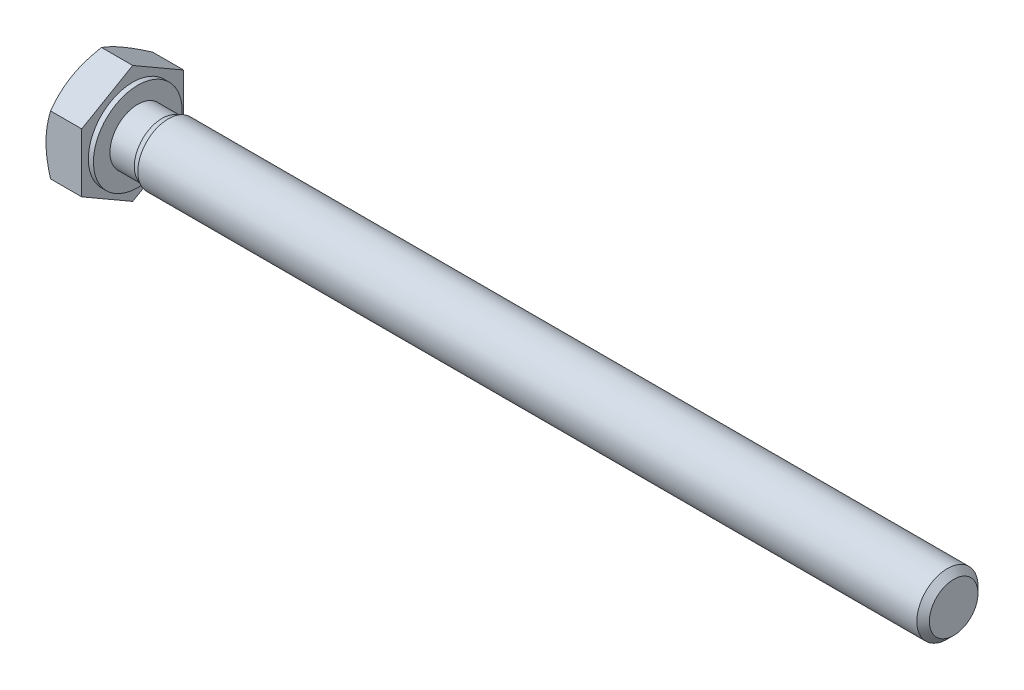
ISO-10303-21;
HEADER;
FILE_DESCRIPTION(('STEP AP214'),'2;1');
FILE_NAME('part.step','',(''),(''),'','','');
FILE_SCHEMA(('AUTOMOTIVE_DESIGN { 1 0 10303 214 1 1 1 1 }'));
ENDSEC;
DATA;
#1=APPLICATION_CONTEXT('core data for automotive mechanical design processes');
#2=APPLICATION_PROTOCOL_DEFINITION('international standard','automotive_design',2000,#1);
#3=PRODUCT_CONTEXT('',#1,'mechanical');
#4=PRODUCT('Part','Part','',(#3));
#5=PRODUCT_RELATED_PRODUCT_CATEGORY('part','',(#4));
#6=PRODUCT_DEFINITION_FORMATION('','',#4);
#7=PRODUCT_DEFINITION_CONTEXT('part definition',#1,'design');
#8=PRODUCT_DEFINITION('design','',#6,#7);
#9=PRODUCT_DEFINITION_SHAPE('','',#8);
#10=(LENGTH_UNIT() NAMED_UNIT(*) SI_UNIT(.MILLI.,.METRE.));
#11=(NAMED_UNIT(*) PLANE_ANGLE_UNIT() SI_UNIT($,.RADIAN.));
#12=(NAMED_UNIT(*) SI_UNIT($,.STERADIAN.) SOLID_ANGLE_UNIT());
#13=UNCERTAINTY_MEASURE_WITH_UNIT(LENGTH_MEASURE(1.E-05),#10,'distance_accuracy_value','');
#14=(GEOMETRIC_REPRESENTATION_CONTEXT(3) GLOBAL_UNCERTAINTY_ASSIGNED_CONTEXT((#13)) GLOBAL_UNIT_ASSIGNED_CONTEXT((#10,
#11,#12)) REPRESENTATION_CONTEXT('',''));
#15=CARTESIAN_POINT('',(0.,0.,0.));
#16=DIRECTION('',(0.,0.,1.));
#17=DIRECTION('',(1.,0.,0.));
#18=AXIS2_PLACEMENT_3D('',#15,#16,#17);
#19=CARTESIAN_POINT('',(-4.00009999999999,0.,0.));
#20=DIRECTION('',(1.,0.,0.));
#21=DIRECTION('',(0.,1.,0.));
#22=AXIS2_PLACEMENT_3D('',#19,#20,#21);
#23=PLANE('',#22);
#24=CARTESIAN_POINT('',(-4.00009999998474,0.,0.));
#25=DIRECTION('',(1.,0.,0.));
#26=DIRECTION('',(0.,0.,-1.));
#27=AXIS2_PLACEMENT_3D('',#24,#25,#26);
#28=CIRCLE('',#27,5.0000000000523);
#29=CARTESIAN_POINT('',(-4.00009999999984,4.33012701894484,-2.50000000001307));
#30=VERTEX_POINT('',#29);
#31=CARTESIAN_POINT('',(-4.00009999999984,4.33012701894484,2.50000000001307));
#32=VERTEX_POINT('',#31);
#33=EDGE_CURVE('E372',#30,#32,#28,.T.);
#34=ORIENTED_EDGE('',*,*,#33,.F.);
#35=CARTESIAN_POINT('',(-4.00009999998474,0.,0.));
#36=DIRECTION('',(1.,0.,0.));
#37=DIRECTION('',(0.,0.,-1.));
#38=AXIS2_PLACEMENT_3D('',#35,#36,#37);
#39=CIRCLE('',#38,5.0000000000523);
#40=CARTESIAN_POINT('',(-4.00009999999984,0.,-5.00000000002615));
#41=VERTEX_POINT('',#40);
#42=EDGE_CURVE('E368',#41,#30,#39,.T.);
#43=ORIENTED_EDGE('',*,*,#42,.F.);
#44=CARTESIAN_POINT('',(-4.00009999998474,0.,0.));
#45=DIRECTION('',(1.,0.,0.));
#46=DIRECTION('',(0.,0.,-1.));
#47=AXIS2_PLACEMENT_3D('',#44,#45,#46);
#48=CIRCLE('',#47,5.0000000000523);
#49=CARTESIAN_POINT('',(-4.00009999999984,-4.33012701894484,-2.50000000001307));
#50=VERTEX_POINT('',#49);
#51=EDGE_CURVE('E364',#50,#41,#48,.T.);
#52=ORIENTED_EDGE('',*,*,#51,.F.);
#53=CARTESIAN_POINT('',(-4.00009999998474,0.,0.));
#54=DIRECTION('',(1.,0.,0.));
#55=DIRECTION('',(0.,0.,-1.));
#56=AXIS2_PLACEMENT_3D('',#53,#54,#55);
#57=CIRCLE('',#56,5.0000000000523);
#58=CARTESIAN_POINT('',(-4.00009999999984,-4.33012701894483,2.50000000001308));
#59=VERTEX_POINT('',#58);
#60=EDGE_CURVE('E91',#59,#50,#57,.T.);
#61=ORIENTED_EDGE('',*,*,#60,.F.);
#62=CARTESIAN_POINT('',(-4.00009999998474,0.,0.));
#63=DIRECTION('',(1.,0.,0.));
#64=DIRECTION('',(0.,0.,-1.));
#65=AXIS2_PLACEMENT_3D('',#62,#63,#64);
#66=CIRCLE('',#65,5.0000000000523);
#67=CARTESIAN_POINT('',(-4.00009999999984,0.,5.00000000002615));
#68=VERTEX_POINT('',#67);
#69=EDGE_CURVE('E88',#68,#59,#66,.T.);
#70=ORIENTED_EDGE('',*,*,#69,.F.);
#71=CARTESIAN_POINT('',(-4.00009999998474,0.,0.));
#72=DIRECTION('',(1.,0.,0.));
#73=DIRECTION('',(0.,0.,-1.));
#74=AXIS2_PLACEMENT_3D('',#71,#72,#73);
#75=CIRCLE('',#74,5.0000000000523);
#76=EDGE_CURVE('E20',#32,#68,#75,.T.);
#77=ORIENTED_EDGE('',*,*,#76,.F.);
#78=EDGE_LOOP('',(#34,#43,#52,#61,#70,#77));
#79=FACE_BOUND('',#78,.T.);
#80=ADVANCED_FACE('F17',(#79),#23,.F.);
#81=CARTESIAN_POINT('',(-3.55083852070948,0.,0.));
#82=DIRECTION('',(1.,0.,0.));
#83=DIRECTION('',(0.,0.,-1.));
#84=AXIS2_PLACEMENT_3D('',#81,#82,#83);
#85=CONICAL_SURFACE('',#84,5.77814370802798,1.04719755118957);
#86=ORIENTED_EDGE('',*,*,#76,.T.);
#87=CARTESIAN_POINT('',(-3.5535180126219,2.88675134595014,5.));
#88=CARTESIAN_POINT('',(-3.6213680084028,2.65177101636253,5.));
#89=CARTESIAN_POINT('',(-3.68353045031979,2.41490887985414,5.));
#90=CARTESIAN_POINT('',(-3.7931527974163,1.93909669052147,5.));
#91=CARTESIAN_POINT('',(-3.84068540344243,1.70016323445544,5.));
#92=CARTESIAN_POINT('',(-3.8990473736487,1.33950809840886,5.));
#93=CARTESIAN_POINT('',(-3.91635229197859,1.21883413511203,5.));
#94=CARTESIAN_POINT('',(-3.94630746633662,0.976908493067109,5.));
#95=CARTESIAN_POINT('',(-3.95895784487578,0.855656829609632,5.));
#96=CARTESIAN_POINT('',(-3.97938167271728,0.612127292346121,5.));
#97=CARTESIAN_POINT('',(-3.987130320757,0.489847322565377,5.));
#98=CARTESIAN_POINT('',(-3.99750020954607,0.245046897906998,5.));
#99=CARTESIAN_POINT('',(-4.00012043482862,0.12252640020956,5.));
#100=CARTESIAN_POINT('',(-4.00010000001493,0.,5.));
#101=B_SPLINE_CURVE_WITH_KNOTS('',3,(#87,#88,#89,#90,#91,#92,#93,#94,#95,#96,#97,#98,#99,#100),
.UNSPECIFIED.,.F.,.F.,(4,2,2,2,2,2,4),(0.,0.734036658391596,1.46436443241683,1.83000749078349,
2.19564092445833,2.563109858667,2.93065154716785),.UNSPECIFIED.);
#102=CARTESIAN_POINT('',(-3.5535180126219,2.88675134594861,5.00000000000089));
#103=VERTEX_POINT('',#102);
#104=EDGE_CURVE('E109',#103,#68,#101,.T.);
#105=ORIENTED_EDGE('',*,*,#104,.F.);
#106=CARTESIAN_POINT('',(-4.00010000001494,4.33012701892219,2.5));
#107=CARTESIAN_POINT('',(-4.00012043482862,4.2688638188174,2.60611097521574));
#108=CARTESIAN_POINT('',(-3.99750020954607,4.20760356996868,2.71221683870603));
#109=CARTESIAN_POINT('',(-3.987130320757,4.08520335763949,2.92422022531741));
#110=CARTESIAN_POINT('',(-3.97938167271728,4.02406337274912,3.03011778552153));
#111=CARTESIAN_POINT('',(-3.95895784487578,3.90229860411736,3.2410205513636));
#112=CARTESIAN_POINT('',(-3.94630746633662,3.84167277238862,3.3460275721689));
#113=CARTESIAN_POINT('',(-3.91635229197859,3.72070995136616,3.55554132400667));
#114=CARTESIAN_POINT('',(-3.8990473736487,3.66037296971774,3.66004804179708));
#115=CARTESIAN_POINT('',(-3.84068540344243,3.48004540169445,3.97238455161875));
#116=CARTESIAN_POINT('',(-3.7931527974163,3.36057867366143,4.17930699438595));
#117=CARTESIAN_POINT('',(-3.68353045031978,3.12267257899509,4.59137243777834));
#118=CARTESIAN_POINT('',(-3.62136800840279,3.0042415107409,4.79650106518927));
#119=CARTESIAN_POINT('',(-3.55351801262189,2.88675134594709,5.00000000000178));
#120=B_SPLINE_CURVE_WITH_KNOTS('',3,(#106,#107,#108,#109,#110,#111,#112,#113,#114,#115,#116,
#117,#118,#119),.UNSPECIFIED.,.F.,.F.,(4,2,2,2,2,2,4),(0.,0.36754168850086,0.735010622709534,
1.10064405638438,1.46628711475104,2.19661488877629,2.9306515471679),.UNSPECIFIED.);
#121=EDGE_CURVE('E103',#32,#103,#120,.T.);
#122=ORIENTED_EDGE('',*,*,#121,.F.);
#123=EDGE_LOOP('',(#86,#105,#122));
#124=FACE_BOUND('',#123,.T.);
#125=ADVANCED_FACE('F108',(#124),#85,.T.);
#126=CARTESIAN_POINT('',(-3.55083852070948,0.,0.));
#127=DIRECTION('',(1.,0.,0.));
#128=DIRECTION('',(0.,0.,-1.));
#129=AXIS2_PLACEMENT_3D('',#126,#127,#128);
#130=CONICAL_SURFACE('',#129,5.77814370802798,1.04719755118957);
#131=CARTESIAN_POINT('',(-4.00010000001493,0.,5.));
#132=CARTESIAN_POINT('',(-4.00012043482862,-0.122526400209565,5.));
#133=CARTESIAN_POINT('',(-3.99750020954607,-0.245046897907004,5.));
#134=CARTESIAN_POINT('',(-3.987130320757,-0.489847322565383,5.));
#135=CARTESIAN_POINT('',(-3.97938167271728,-0.612127292346127,5.));
#136=CARTESIAN_POINT('',(-3.95895784487578,-0.85565682960964,5.));
#137=CARTESIAN_POINT('',(-3.94630746633662,-0.976908493067117,5.));
#138=CARTESIAN_POINT('',(-3.91635229197859,-1.21883413511204,5.));
#139=CARTESIAN_POINT('',(-3.8990473736487,-1.33950809840887,5.));
#140=CARTESIAN_POINT('',(-3.84068540344243,-1.70016323445545,5.));
#141=CARTESIAN_POINT('',(-3.7931527974163,-1.93909669052148,5.));
#142=CARTESIAN_POINT('',(-3.68353045031978,-2.41490887985415,5.));
#143=CARTESIAN_POINT('',(-3.6213680084028,-2.65177101636254,5.));
#144=CARTESIAN_POINT('',(-3.5535180126219,-2.88675134595016,5.));
#145=B_SPLINE_CURVE_WITH_KNOTS('',3,(#131,#132,#133,#134,#135,#136,#137,#138,#139,#140,#141,
#142,#143,#144),.UNSPECIFIED.,.F.,.F.,(4,2,2,2,2,2,4),(0.,0.367541688500856,0.735010622709525,
1.10064405638437,1.46628711475103,2.19661488877626,2.93065154716786),.UNSPECIFIED.);
#146=CARTESIAN_POINT('',(-3.5535180126219,-2.88675134594863,5.00000000000089));
#147=VERTEX_POINT('',#146);
#148=EDGE_CURVE('E96',#68,#147,#145,.T.);
#149=ORIENTED_EDGE('',*,*,#148,.F.);
#150=ORIENTED_EDGE('',*,*,#69,.T.);
#151=CARTESIAN_POINT('',(-3.55351801262189,-2.8867513459471,5.00000000000177));
#152=CARTESIAN_POINT('',(-3.62136800840279,-3.00424151074091,4.79650106518926));
#153=CARTESIAN_POINT('',(-3.68353045031978,-3.12267257899511,4.59137243777833));
#154=CARTESIAN_POINT('',(-3.7931527974163,-3.36057867366144,4.17930699438595));
#155=CARTESIAN_POINT('',(-3.84068540344242,-3.48004540169446,3.97238455161875));
#156=CARTESIAN_POINT('',(-3.8990473736487,-3.66037296971775,3.66004804179708));
#157=CARTESIAN_POINT('',(-3.91635229197859,-3.72070995136617,3.55554132400667));
#158=CARTESIAN_POINT('',(-3.94630746633662,-3.84167277238863,3.3460275721689));
#159=CARTESIAN_POINT('',(-3.95895784487578,-3.90229860411737,3.2410205513636));
#160=CARTESIAN_POINT('',(-3.97938167271728,-4.02406337274912,3.03011778552153));
#161=CARTESIAN_POINT('',(-3.987130320757,-4.0852033576395,2.92422022531741));
#162=CARTESIAN_POINT('',(-3.99750020954607,-4.20760356996869,2.71221683870604));
#163=CARTESIAN_POINT('',(-4.00012043482862,-4.26886381881741,2.60611097521574));
#164=CARTESIAN_POINT('',(-4.00010000001494,-4.33012701892219,2.5));
#165=B_SPLINE_CURVE_WITH_KNOTS('',3,(#151,#152,#153,#154,#155,#156,#157,#158,#159,#160,#161,
#162,#163,#164),.UNSPECIFIED.,.F.,.F.,(4,2,2,2,2,2,4),(0.,0.734036658391605,1.46436443241685,
1.83000749078351,2.19564092445836,2.56310985866703,2.93065154716789),.UNSPECIFIED.);
#166=EDGE_CURVE('E98',#147,#59,#165,.T.);
#167=ORIENTED_EDGE('',*,*,#166,.F.);
#168=EDGE_LOOP('',(#149,#150,#167));
#169=FACE_BOUND('',#168,.T.);
#170=ADVANCED_FACE('F97',(#169),#130,.T.);
#171=CARTESIAN_POINT('',(-3.55083852070948,0.,0.));
#172=DIRECTION('',(1.,0.,0.));
#173=DIRECTION('',(0.,0.,-1.));
#174=AXIS2_PLACEMENT_3D('',#171,#172,#173);
#175=CONICAL_SURFACE('',#174,5.77814370802798,1.04719755118957);
#176=CARTESIAN_POINT('',(-4.00010000001494,-4.33012701892219,2.5));
#177=CARTESIAN_POINT('',(-4.00012043482862,-4.39139021902697,2.39388902478426));
#178=CARTESIAN_POINT('',(-3.99750020954607,-4.45265046787569,2.28778316129396));
#179=CARTESIAN_POINT('',(-3.987130320757,-4.57505068020488,2.07577977468259));
#180=CARTESIAN_POINT('',(-3.97938167271728,-4.63619066509525,1.96988221447847));
#181=CARTESIAN_POINT('',(-3.95895784487578,-4.75795543372701,1.7589794486364));
#182=CARTESIAN_POINT('',(-3.94630746633662,-4.81858126545575,1.6539724278311));
#183=CARTESIAN_POINT('',(-3.91635229197859,-4.93954408647821,1.44445867599334));
#184=CARTESIAN_POINT('',(-3.8990473736487,-4.99988106812662,1.33995195820293));
#185=CARTESIAN_POINT('',(-3.84068540344243,-5.18020863614991,1.02761544838126));
#186=CARTESIAN_POINT('',(-3.7931527974163,-5.29967536418293,0.820693005614064));
#187=CARTESIAN_POINT('',(-3.68353045031979,-5.53758145884926,0.408627562221682));
#188=CARTESIAN_POINT('',(-3.6213680084028,-5.65601252710346,0.203498934810755));
#189=CARTESIAN_POINT('',(-3.5535180126219,-5.77350269189727,-1.75765285842056E-12));
#190=B_SPLINE_CURVE_WITH_KNOTS('',3,(#176,#177,#178,#179,#180,#181,#182,#183,#184,#185,#186,
#187,#188,#189),.UNSPECIFIED.,.F.,.F.,(4,2,2,2,2,2,4),(0.,0.367541688500856,0.735010622709525,
1.10064405638437,1.46628711475103,2.19661488877627,2.93065154716787),.UNSPECIFIED.);
#191=CARTESIAN_POINT('',(-3.5535180126219,-5.77350269189727,0.));
#192=VERTEX_POINT('',#191);
#193=EDGE_CURVE('E114',#59,#192,#190,.T.);
#194=ORIENTED_EDGE('',*,*,#193,.F.);
#195=ORIENTED_EDGE('',*,*,#60,.T.);
#196=CARTESIAN_POINT('',(-3.55351801262189,-5.77350269189728,1.78056399076284E-12));
#197=CARTESIAN_POINT('',(-3.62136800840279,-5.65601252710347,-0.203498934810734));
#198=CARTESIAN_POINT('',(-3.68353045031978,-5.53758145884927,-0.408627562221662));
#199=CARTESIAN_POINT('',(-3.7931527974163,-5.29967536418294,-0.820693005614048));
#200=CARTESIAN_POINT('',(-3.84068540344243,-5.18020863614992,-1.02761544838124));
#201=CARTESIAN_POINT('',(-3.8990473736487,-4.99988106812663,-1.33995195820292));
#202=CARTESIAN_POINT('',(-3.91635229197859,-4.93954408647821,-1.44445867599333));
#203=CARTESIAN_POINT('',(-3.94630746633662,-4.81858126545575,-1.65397242783109));
#204=CARTESIAN_POINT('',(-3.95895784487578,-4.75795543372701,-1.75897944863639));
#205=CARTESIAN_POINT('',(-3.97938167271728,-4.63619066509525,-1.96988221447846));
#206=CARTESIAN_POINT('',(-3.987130320757,-4.57505068020488,-2.07577977468258));
#207=CARTESIAN_POINT('',(-3.99750020954607,-4.45265046787569,-2.28778316129396));
#208=CARTESIAN_POINT('',(-4.00012043482862,-4.39139021902697,-2.39388902478426));
#209=CARTESIAN_POINT('',(-4.00010000001494,-4.33012701892219,-2.5));
#210=B_SPLINE_CURVE_WITH_KNOTS('',3,(#196,#197,#198,#199,#200,#201,#202,#203,#204,#205,#206,
#207,#208,#209),.UNSPECIFIED.,.F.,.F.,(4,2,2,2,2,2,4),(0.,0.734036658391606,1.46436443241685,
1.83000749078351,2.19564092445836,2.56310985866703,2.93065154716789),.UNSPECIFIED.);
#211=EDGE_CURVE('E208',#192,#50,#210,.T.);
#212=ORIENTED_EDGE('',*,*,#211,.F.);
#213=EDGE_LOOP('',(#194,#195,#212));
#214=FACE_BOUND('',#213,.T.);
#215=ADVANCED_FACE('F216',(#214),#175,.T.);
#216=CARTESIAN_POINT('',(-3.55083852070948,0.,0.));
#217=DIRECTION('',(1.,0.,0.));
#218=DIRECTION('',(0.,0.,-1.));
#219=AXIS2_PLACEMENT_3D('',#216,#217,#218);
#220=CONICAL_SURFACE('',#219,5.77814370802798,1.04719755118957);
#221=CARTESIAN_POINT('',(-4.00010000001494,-4.33012701892219,-2.5));
#222=CARTESIAN_POINT('',(-4.00012043482862,-4.26886381881741,-2.60611097521574));
#223=CARTESIAN_POINT('',(-3.99750020954607,-4.20760356996869,-2.71221683870603));
#224=CARTESIAN_POINT('',(-3.987130320757,-4.0852033576395,-2.92422022531741));
#225=CARTESIAN_POINT('',(-3.97938167271728,-4.02406337274912,-3.03011778552153));
#226=CARTESIAN_POINT('',(-3.95895784487578,-3.90229860411737,-3.2410205513636));
#227=CARTESIAN_POINT('',(-3.94630746633662,-3.84167277238863,-3.34602757216889));
#228=CARTESIAN_POINT('',(-3.91635229197859,-3.72070995136617,-3.55554132400666));
#229=CARTESIAN_POINT('',(-3.8990473736487,-3.66037296971775,-3.66004804179707));
#230=CARTESIAN_POINT('',(-3.84068540344243,-3.48004540169446,-3.97238455161874));
#231=CARTESIAN_POINT('',(-3.7931527974163,-3.36057867366145,-4.17930699438593));
#232=CARTESIAN_POINT('',(-3.68353045031979,-3.12267257899511,-4.59137243777831));
#233=CARTESIAN_POINT('',(-3.6213680084028,-3.00424151074092,-4.79650106518924));
#234=CARTESIAN_POINT('',(-3.5535180126219,-2.88675134594711,-5.00000000000175));
#235=B_SPLINE_CURVE_WITH_KNOTS('',3,(#221,#222,#223,#224,#225,#226,#227,#228,#229,#230,#231,
#232,#233,#234),.UNSPECIFIED.,.F.,.F.,(4,2,2,2,2,2,4),(0.,0.367541688500856,0.735010622709525,
1.10064405638437,1.46628711475103,2.19661488877626,2.93065154716786),.UNSPECIFIED.);
#236=CARTESIAN_POINT('',(-3.5535180126219,-2.88675134594865,-5.00000000000088));
#237=VERTEX_POINT('',#236);
#238=EDGE_CURVE('E220',#50,#237,#235,.T.);
#239=ORIENTED_EDGE('',*,*,#238,.F.);
#240=ORIENTED_EDGE('',*,*,#51,.T.);
#241=CARTESIAN_POINT('',(-3.55351801262189,-2.88675134595018,-5.));
#242=CARTESIAN_POINT('',(-3.62136800840279,-2.65177101636257,-5.));
#243=CARTESIAN_POINT('',(-3.68353045031978,-2.41490887985417,-5.));
#244=CARTESIAN_POINT('',(-3.7931527974163,-1.9390966905215,-5.));
#245=CARTESIAN_POINT('',(-3.84068540344242,-1.70016323445547,-5.));
#246=CARTESIAN_POINT('',(-3.8990473736487,-1.33950809840888,-5.));
#247=CARTESIAN_POINT('',(-3.91635229197858,-1.21883413511205,-5.));
#248=CARTESIAN_POINT('',(-3.94630746633661,-0.976908493067124,-5.));
#249=CARTESIAN_POINT('',(-3.95895784487578,-0.855656829609646,-5.));
#250=CARTESIAN_POINT('',(-3.97938167271728,-0.612127292346131,-5.));
#251=CARTESIAN_POINT('',(-3.98713032075699,-0.489847322565385,-5.));
#252=CARTESIAN_POINT('',(-3.99750020954606,-0.245046897907004,-5.));
#253=CARTESIAN_POINT('',(-4.00012043482862,-0.122526400209564,-5.));
#254=CARTESIAN_POINT('',(-4.00010000001493,0.,-5.));
#255=B_SPLINE_CURVE_WITH_KNOTS('',3,(#241,#242,#243,#244,#245,#246,#247,#248,#249,#250,#251,
#252,#253,#254),.UNSPECIFIED.,.F.,.F.,(4,2,2,2,2,2,4),(0.,0.734036658391605,1.46436443241685,
1.83000749078351,2.19564092445836,2.56310985866703,2.93065154716789),.UNSPECIFIED.);
#256=EDGE_CURVE('E202',#237,#41,#255,.T.);
#257=ORIENTED_EDGE('',*,*,#256,.F.);
#258=EDGE_LOOP('',(#239,#240,#257));
#259=FACE_BOUND('',#258,.T.);
#260=ADVANCED_FACE('F213',(#259),#220,.T.);
#261=CARTESIAN_POINT('',(-3.55083852070948,0.,0.));
#262=DIRECTION('',(1.,0.,0.));
#263=DIRECTION('',(0.,0.,-1.));
#264=AXIS2_PLACEMENT_3D('',#261,#262,#263);
#265=CONICAL_SURFACE('',#264,5.77814370802798,1.04719755118957);
#266=ORIENTED_EDGE('',*,*,#42,.T.);
#267=CARTESIAN_POINT('',(-3.55351801262189,2.8867513459471,-5.00000000000177));
#268=CARTESIAN_POINT('',(-3.62136800840279,3.00424151074091,-4.79650106518926));
#269=CARTESIAN_POINT('',(-3.68353045031978,3.12267257899511,-4.59137243777833));
#270=CARTESIAN_POINT('',(-3.7931527974163,3.36057867366144,-4.17930699438595));
#271=CARTESIAN_POINT('',(-3.84068540344242,3.48004540169446,-3.97238455161875));
#272=CARTESIAN_POINT('',(-3.8990473736487,3.66037296971775,-3.66004804179708));
#273=CARTESIAN_POINT('',(-3.91635229197859,3.72070995136617,-3.55554132400667));
#274=CARTESIAN_POINT('',(-3.94630746633662,3.84167277238863,-3.3460275721689));
#275=CARTESIAN_POINT('',(-3.95895784487578,3.90229860411737,-3.2410205513636));
#276=CARTESIAN_POINT('',(-3.97938167271728,4.02406337274912,-3.03011778552153));
#277=CARTESIAN_POINT('',(-3.987130320757,4.0852033576395,-2.92422022531741));
#278=CARTESIAN_POINT('',(-3.99750020954607,4.20760356996869,-2.71221683870604));
#279=CARTESIAN_POINT('',(-4.00012043482862,4.26886381881741,-2.60611097521574));
#280=CARTESIAN_POINT('',(-4.00010000001494,4.33012701892219,-2.5));
#281=B_SPLINE_CURVE_WITH_KNOTS('',3,(#267,#268,#269,#270,#271,#272,#273,#274,#275,#276,#277,
#278,#279,#280),.UNSPECIFIED.,.F.,.F.,(4,2,2,2,2,2,4),(0.,0.734036658391605,1.46436443241685,
1.83000749078351,2.19564092445836,2.56310985866703,2.93065154716789),.UNSPECIFIED.);
#282=CARTESIAN_POINT('',(-3.5535180126219,2.88675134594863,-5.00000000000089));
#283=VERTEX_POINT('',#282);
#284=EDGE_CURVE('E174',#283,#30,#281,.T.);
#285=ORIENTED_EDGE('',*,*,#284,.F.);
#286=CARTESIAN_POINT('',(-4.00010000001493,0.,-5.));
#287=CARTESIAN_POINT('',(-4.00012043482862,0.122526400209563,-5.));
#288=CARTESIAN_POINT('',(-3.99750020954606,0.245046897907002,-5.));
#289=CARTESIAN_POINT('',(-3.98713032075699,0.489847322565381,-5.));
#290=CARTESIAN_POINT('',(-3.97938167271728,0.612127292346126,-5.));
#291=CARTESIAN_POINT('',(-3.95895784487578,0.855656829609638,-5.));
#292=CARTESIAN_POINT('',(-3.94630746633661,0.976908493067115,-5.));
#293=CARTESIAN_POINT('',(-3.91635229197859,1.21883413511204,-5.));
#294=CARTESIAN_POINT('',(-3.8990473736487,1.33950809840887,-5.));
#295=CARTESIAN_POINT('',(-3.84068540344243,1.70016323445545,-5.));
#296=CARTESIAN_POINT('',(-3.7931527974163,1.93909669052148,-5.));
#297=CARTESIAN_POINT('',(-3.68353045031978,2.41490887985415,-5.));
#298=CARTESIAN_POINT('',(-3.62136800840279,2.65177101636254,-5.));
#299=CARTESIAN_POINT('',(-3.5535180126219,2.88675134595016,-5.));
#300=B_SPLINE_CURVE_WITH_KNOTS('',3,(#286,#287,#288,#289,#290,#291,#292,#293,#294,#295,#296,
#297,#298,#299),.UNSPECIFIED.,.F.,.F.,(4,2,2,2,2,2,4),(0.,0.367541688500856,0.735010622709525,
1.10064405638437,1.46628711475103,2.19661488877627,2.93065154716786),.UNSPECIFIED.);
#301=EDGE_CURVE('E197',#41,#283,#300,.T.);
#302=ORIENTED_EDGE('',*,*,#301,.F.);
#303=EDGE_LOOP('',(#266,#285,#302));
#304=FACE_BOUND('',#303,.T.);
#305=ADVANCED_FACE('F159',(#304),#265,.T.);
#306=CARTESIAN_POINT('',(-3.55083852070948,0.,0.));
#307=DIRECTION('',(1.,0.,0.));
#308=DIRECTION('',(0.,0.,-1.));
#309=AXIS2_PLACEMENT_3D('',#306,#307,#308);
#310=CONICAL_SURFACE('',#309,5.77814370802798,1.04719755118957);
#311=ORIENTED_EDGE('',*,*,#33,.T.);
#312=CARTESIAN_POINT('',(-3.5535180126219,5.77350269189727,-1.76832138326591E-12));
#313=CARTESIAN_POINT('',(-3.62136800840279,5.65601252710347,0.203498934810745));
#314=CARTESIAN_POINT('',(-3.68353045031978,5.53758145884927,0.408627562221673));
#315=CARTESIAN_POINT('',(-3.7931527974163,5.29967536418293,0.820693005614056));
#316=CARTESIAN_POINT('',(-3.84068540344243,5.18020863614992,1.02761544838125));
#317=CARTESIAN_POINT('',(-3.8990473736487,4.99988106812663,1.33995195820292));
#318=CARTESIAN_POINT('',(-3.91635229197859,4.93954408647821,1.44445867599333));
#319=CARTESIAN_POINT('',(-3.94630746633662,4.81858126545575,1.6539724278311));
#320=CARTESIAN_POINT('',(-3.95895784487578,4.75795543372701,1.75897944863639));
#321=CARTESIAN_POINT('',(-3.97938167271728,4.63619066509525,1.96988221447847));
#322=CARTESIAN_POINT('',(-3.987130320757,4.57505068020488,2.07577977468258));
#323=CARTESIAN_POINT('',(-3.99750020954607,4.45265046787569,2.28778316129396));
#324=CARTESIAN_POINT('',(-4.00012043482862,4.39139021902697,2.39388902478426));
#325=CARTESIAN_POINT('',(-4.00010000001494,4.33012701892219,2.5));
#326=B_SPLINE_CURVE_WITH_KNOTS('',3,(#312,#313,#314,#315,#316,#317,#318,#319,#320,#321,#322,
#323,#324,#325),.UNSPECIFIED.,.F.,.F.,(4,2,2,2,2,2,4),(0.,0.734036658391602,1.46436443241684,
1.8300074907835,2.19564092445835,2.56310985866702,2.93065154716788),.UNSPECIFIED.);
#327=CARTESIAN_POINT('',(-3.55351801262219,5.77350269189676,-8.86341293255561E-13));
#328=VERTEX_POINT('',#327);
#329=EDGE_CURVE('E144',#328,#32,#326,.T.);
#330=ORIENTED_EDGE('',*,*,#329,.F.);
#331=CARTESIAN_POINT('',(-4.00010000001494,4.33012701892219,-2.5));
#332=CARTESIAN_POINT('',(-4.00012043482862,4.39139021902697,-2.39388902478426));
#333=CARTESIAN_POINT('',(-3.99750020954607,4.45265046787569,-2.28778316129396));
#334=CARTESIAN_POINT('',(-3.987130320757,4.57505068020488,-2.07577977468259));
#335=CARTESIAN_POINT('',(-3.97938167271728,4.63619066509525,-1.96988221447847));
#336=CARTESIAN_POINT('',(-3.95895784487578,4.75795543372701,-1.7589794486364));
#337=CARTESIAN_POINT('',(-3.94630746633662,4.81858126545575,-1.6539724278311));
#338=CARTESIAN_POINT('',(-3.91635229197859,4.93954408647821,-1.44445867599333));
#339=CARTESIAN_POINT('',(-3.8990473736487,4.99988106812663,-1.33995195820293));
#340=CARTESIAN_POINT('',(-3.84068540344243,5.18020863614992,-1.02761544838125));
#341=CARTESIAN_POINT('',(-3.7931527974163,5.29967536418293,-0.820693005614057));
#342=CARTESIAN_POINT('',(-3.68353045031978,5.53758145884927,-0.408627562221674));
#343=CARTESIAN_POINT('',(-3.62136800840279,5.65601252710347,-0.203498934810746));
#344=CARTESIAN_POINT('',(-3.5535180126219,5.77350269189727,1.76779477828144E-12));
#345=B_SPLINE_CURVE_WITH_KNOTS('',3,(#331,#332,#333,#334,#335,#336,#337,#338,#339,#340,#341,
#342,#343,#344),.UNSPECIFIED.,.F.,.F.,(4,2,2,2,2,2,4),(0.,0.367541688500857,0.735010622709529,
1.10064405638437,1.46628711475103,2.19661488877628,2.93065154716788),.UNSPECIFIED.);
#346=EDGE_CURVE('E165',#30,#328,#345,.T.);
#347=ORIENTED_EDGE('',*,*,#346,.F.);
#348=EDGE_LOOP('',(#311,#330,#347));
#349=FACE_BOUND('',#348,.T.);
#350=ADVANCED_FACE('F153',(#349),#310,.T.);
#351=CARTESIAN_POINT('',(-0.500099999999994,5.77350269189625,0.));
#352=DIRECTION('',(0.,0.866025403784438,0.500000000000001));
#353=DIRECTION('',(0.,-0.500000000000001,0.866025403784438));
#354=AXIS2_PLACEMENT_3D('',#351,#352,#353);
#355=PLANE('',#354);
#356=DIRECTION('',(0.,-0.5,0.866025403784438));
#357=VECTOR('',#356,1.);
#358=CARTESIAN_POINT('',(-0.500099999999995,5.77350269189625,0.));
#359=LINE('',#358,#357);
#360=CARTESIAN_POINT('',(-0.500099999999994,5.77350269189625,0.));
#361=VERTEX_POINT('',#360);
#362=CARTESIAN_POINT('',(-0.500099999999994,2.88675134594812,5.));
#363=VERTEX_POINT('',#362);
#364=EDGE_CURVE('E296',#361,#363,#359,.T.);
#365=ORIENTED_EDGE('',*,*,#364,.F.);
#366=DIRECTION('',(1.,0.,0.));
#367=VECTOR('',#366,1.);
#368=CARTESIAN_POINT('',(-0.500099999999994,5.77350269189625,0.));
#369=LINE('',#368,#367);
#370=EDGE_CURVE('E173',#328,#361,#369,.T.);
#371=ORIENTED_EDGE('',*,*,#370,.F.);
#372=ORIENTED_EDGE('',*,*,#329,.T.);
#373=ORIENTED_EDGE('',*,*,#121,.T.);
#374=DIRECTION('',(1.,0.,0.));
#375=VECTOR('',#374,1.);
#376=CARTESIAN_POINT('',(-0.500099999999994,2.88675134594812,5.));
#377=LINE('',#376,#375);
#378=EDGE_CURVE('E102',#363,#103,#377,.F.);
#379=ORIENTED_EDGE('',*,*,#378,.F.);
#380=EDGE_LOOP('',(#365,#371,#372,#373,#379));
#381=FACE_BOUND('',#380,.T.);
#382=ADVANCED_FACE('F150',(#381),#355,.T.);
#383=CARTESIAN_POINT('',(-0.500099999999994,2.88675134594812,5.));
#384=DIRECTION('',(0.,0.,1.));
#385=DIRECTION('',(0.,-1.,0.));
#386=AXIS2_PLACEMENT_3D('',#383,#384,#385);
#387=PLANE('',#386);
#388=ORIENTED_EDGE('',*,*,#378,.T.);
#389=ORIENTED_EDGE('',*,*,#104,.T.);
#390=ORIENTED_EDGE('',*,*,#148,.T.);
#391=DIRECTION('',(1.,0.,0.));
#392=VECTOR('',#391,1.);
#393=CARTESIAN_POINT('',(-0.500099999999993,-2.88675134594813,4.99999999999999));
#394=LINE('',#393,#392);
#395=CARTESIAN_POINT('',(-0.500099999999993,-2.88675134594813,5.));
#396=VERTEX_POINT('',#395);
#397=EDGE_CURVE('E116',#396,#147,#394,.F.);
#398=ORIENTED_EDGE('',*,*,#397,.F.);
#399=DIRECTION('',(0.,1.,0.));
#400=VECTOR('',#399,1.);
#401=CARTESIAN_POINT('',(-0.500099999999994,0.,5.));
#402=LINE('',#401,#400);
#403=EDGE_CURVE('E292',#363,#396,#402,.F.);
#404=ORIENTED_EDGE('',*,*,#403,.F.);
#405=EDGE_LOOP('',(#388,#389,#390,#398,#404));
#406=FACE_BOUND('',#405,.T.);
#407=ADVANCED_FACE('F112',(#406),#387,.T.);
#408=CARTESIAN_POINT('',(-0.500099999999993,-2.88675134594813,4.99999999999999));
#409=DIRECTION('',(0.,-0.866025403784439,0.5));
#410=DIRECTION('',(0.,-0.5,-0.866025403784439));
#411=AXIS2_PLACEMENT_3D('',#408,#409,#410);
#412=PLANE('',#411);
#413=ORIENTED_EDGE('',*,*,#397,.T.);
#414=ORIENTED_EDGE('',*,*,#166,.T.);
#415=ORIENTED_EDGE('',*,*,#193,.T.);
#416=DIRECTION('',(1.,0.,0.));
#417=VECTOR('',#416,1.);
#418=CARTESIAN_POINT('',(-0.500099999999993,-5.77350269189625,0.));
#419=LINE('',#418,#417);
#420=CARTESIAN_POINT('',(-0.500099999999993,-5.77350269189625,0.));
#421=VERTEX_POINT('',#420);
#422=EDGE_CURVE('E225',#421,#192,#419,.F.);
#423=ORIENTED_EDGE('',*,*,#422,.F.);
#424=DIRECTION('',(0.,-0.499999999999999,-0.866025403784439));
#425=VECTOR('',#424,1.);
#426=CARTESIAN_POINT('',(-0.500099999999994,-2.88675134594813,4.99999999999999));
#427=LINE('',#426,#425);
#428=EDGE_CURVE('E295',#396,#421,#427,.T.);
#429=ORIENTED_EDGE('',*,*,#428,.F.);
#430=EDGE_LOOP('',(#413,#414,#415,#423,#429));
#431=FACE_BOUND('',#430,.T.);
#432=ADVANCED_FACE('F229',(#431),#412,.T.);
#433=CARTESIAN_POINT('',(-0.500099999999993,-5.77350269189625,0.));
#434=DIRECTION('',(0.,-0.866025403784438,-0.5));
#435=DIRECTION('',(0.,0.5,-0.866025403784438));
#436=AXIS2_PLACEMENT_3D('',#433,#434,#435);
#437=PLANE('',#436);
#438=ORIENTED_EDGE('',*,*,#422,.T.);
#439=ORIENTED_EDGE('',*,*,#211,.T.);
#440=ORIENTED_EDGE('',*,*,#238,.T.);
#441=DIRECTION('',(1.,0.,0.));
#442=VECTOR('',#441,1.);
#443=CARTESIAN_POINT('',(-0.500099999999993,-2.88675134594812,-5.));
#444=LINE('',#443,#442);
#445=CARTESIAN_POINT('',(-0.500099999999994,-2.88675134594813,-5.));
#446=VERTEX_POINT('',#445);
#447=EDGE_CURVE('E330',#446,#237,#444,.F.);
#448=ORIENTED_EDGE('',*,*,#447,.F.);
#449=DIRECTION('',(0.,0.5,-0.866025403784438));
#450=VECTOR('',#449,1.);
#451=CARTESIAN_POINT('',(-0.500099999999993,-5.77350269189625,0.));
#452=LINE('',#451,#450);
#453=EDGE_CURVE('E301',#421,#446,#452,.T.);
#454=ORIENTED_EDGE('',*,*,#453,.F.);
#455=EDGE_LOOP('',(#438,#439,#440,#448,#454));
#456=FACE_BOUND('',#455,.T.);
#457=ADVANCED_FACE('F194',(#456),#437,.T.);
#458=CARTESIAN_POINT('',(-0.500099999999993,-2.88675134594812,-5.));
#459=DIRECTION('',(0.,0.,-1.));
#460=DIRECTION('',(0.,1.,0.));
#461=AXIS2_PLACEMENT_3D('',#458,#459,#460);
#462=PLANE('',#461);
#463=DIRECTION('',(0.,1.,0.));
#464=VECTOR('',#463,1.);
#465=CARTESIAN_POINT('',(-0.500099999999994,0.,-5.));
#466=LINE('',#465,#464);
#467=CARTESIAN_POINT('',(-0.500099999999994,2.88675134594813,-4.99999999999999));
#468=VERTEX_POINT('',#467);
#469=EDGE_CURVE('E306',#446,#468,#466,.T.);
#470=ORIENTED_EDGE('',*,*,#469,.F.);
#471=ORIENTED_EDGE('',*,*,#447,.T.);
#472=ORIENTED_EDGE('',*,*,#256,.T.);
#473=ORIENTED_EDGE('',*,*,#301,.T.);
#474=DIRECTION('',(1.,0.,0.));
#475=VECTOR('',#474,1.);
#476=CARTESIAN_POINT('',(-0.500099999999994,2.88675134594813,-4.99999999999999));
#477=LINE('',#476,#475);
#478=EDGE_CURVE('E35',#468,#283,#477,.F.);
#479=ORIENTED_EDGE('',*,*,#478,.F.);
#480=EDGE_LOOP('',(#470,#471,#472,#473,#479));
#481=FACE_BOUND('',#480,.T.);
#482=ADVANCED_FACE('F187',(#481),#462,.T.);
#483=CARTESIAN_POINT('',(-0.500099999999994,2.88675134594813,-4.99999999999999));
#484=DIRECTION('',(0.,0.866025403784439,-0.5));
#485=DIRECTION('',(0.,0.5,0.866025403784439));
#486=AXIS2_PLACEMENT_3D('',#483,#484,#485);
#487=PLANE('',#486);
#488=DIRECTION('',(0.,0.499999999999999,0.866025403784439));
#489=VECTOR('',#488,1.);
#490=CARTESIAN_POINT('',(-0.500099999999994,2.88675134594813,-4.99999999999999));
#491=LINE('',#490,#489);
#492=EDGE_CURVE('E285',#468,#361,#491,.T.);
#493=ORIENTED_EDGE('',*,*,#492,.F.);
#494=ORIENTED_EDGE('',*,*,#478,.T.);
#495=ORIENTED_EDGE('',*,*,#284,.T.);
#496=ORIENTED_EDGE('',*,*,#346,.T.);
#497=ORIENTED_EDGE('',*,*,#370,.T.);
#498=EDGE_LOOP('',(#493,#494,#495,#496,#497));
#499=FACE_BOUND('',#498,.T.);
#500=ADVANCED_FACE('F181',(#499),#487,.T.);
#501=CARTESIAN_POINT('',(-0.500099999999994,0.,0.));
#502=DIRECTION('',(1.,0.,0.));
#503=DIRECTION('',(0.,1.,0.));
#504=AXIS2_PLACEMENT_3D('',#501,#502,#503);
#505=PLANE('',#504);
#506=CARTESIAN_POINT('',(-0.500099999999994,0.,0.));
#507=DIRECTION('',(1.,0.,0.));
#508=DIRECTION('',(0.,1.,0.));
#509=AXIS2_PLACEMENT_3D('',#506,#507,#508);
#510=CIRCLE('',#509,4.35);
#511=CARTESIAN_POINT('',(-0.500099999999995,4.35,0.));
#512=VERTEX_POINT('',#511);
#513=EDGE_CURVE('E175',#512,#512,#510,.T.);
#514=ORIENTED_EDGE('',*,*,#513,.F.);
#515=EDGE_LOOP('',(#514));
#516=FACE_BOUND('',#515,.T.);
#517=ORIENTED_EDGE('',*,*,#469,.T.);
#518=ORIENTED_EDGE('',*,*,#492,.T.);
#519=ORIENTED_EDGE('',*,*,#364,.T.);
#520=ORIENTED_EDGE('',*,*,#403,.T.);
#521=ORIENTED_EDGE('',*,*,#428,.T.);
#522=ORIENTED_EDGE('',*,*,#453,.T.);
#523=EDGE_LOOP('',(#517,#518,#519,#520,#521,#522));
#524=FACE_BOUND('',#523,.T.);
#525=ADVANCED_FACE('F186',(#516,#524),#505,.T.);
#526=CARTESIAN_POINT('',(-0.250050000000002,0.,0.));
#527=DIRECTION('',(1.,0.,0.));
#528=DIRECTION('',(0.,1.,0.));
#529=AXIS2_PLACEMENT_3D('',#526,#527,#528);
#530=CYLINDRICAL_SURFACE('',#529,4.35);
#531=ORIENTED_EDGE('',*,*,#513,.T.);
#532=EDGE_LOOP('',(#531));
#533=FACE_BOUND('',#532,.T.);
#534=CARTESIAN_POINT('',(0.,0.,0.));
#535=DIRECTION('',(1.,0.,0.));
#536=DIRECTION('',(0.,1.,0.));
#537=AXIS2_PLACEMENT_3D('',#534,#535,#536);
#538=CIRCLE('',#537,4.35);
#539=CARTESIAN_POINT('',(0.,4.35,0.));
#540=VERTEX_POINT('',#539);
#541=EDGE_CURVE('E279',#540,#540,#538,.T.);
#542=ORIENTED_EDGE('',*,*,#541,.F.);
#543=EDGE_LOOP('',(#542));
#544=FACE_BOUND('',#543,.T.);
#545=ADVANCED_FACE('F266',(#533,#544),#530,.T.);
#546=CARTESIAN_POINT('',(0.,3.5396835,0.));
#547=DIRECTION('',(1.,0.,0.));
#548=DIRECTION('',(0.,1.,0.));
#549=AXIS2_PLACEMENT_3D('',#546,#547,#548);
#550=PLANE('',#549);
#551=CARTESIAN_POINT('',(0.,0.,0.));
#552=DIRECTION('',(1.,0.,0.));
#553=DIRECTION('',(0.,1.,0.));
#554=AXIS2_PLACEMENT_3D('',#551,#552,#553);
#555=CIRCLE('',#554,2.729367);
#556=CARTESIAN_POINT('',(0.,2.729367,0.));
#557=VERTEX_POINT('',#556);
#558=EDGE_CURVE('E281',#557,#557,#555,.T.);
#559=ORIENTED_EDGE('',*,*,#558,.F.);
#560=EDGE_LOOP('',(#559));
#561=FACE_BOUND('',#560,.T.);
#562=ORIENTED_EDGE('',*,*,#541,.T.);
#563=EDGE_LOOP('',(#562));
#564=FACE_BOUND('',#563,.T.);
#565=ADVANCED_FACE('F263',(#561,#564),#550,.T.);
#566=CARTESIAN_POINT('',(80.,1.50000000000001,0.));
#567=DIRECTION('',(1.,0.,0.));
#568=DIRECTION('',(0.,1.,0.));
#569=AXIS2_PLACEMENT_3D('',#566,#567,#568);
#570=PLANE('',#569);
#571=CARTESIAN_POINT('',(79.9999999999841,0.,0.));
#572=DIRECTION('',(-1.,0.,0.));
#573=DIRECTION('',(0.,0.,1.));
#574=AXIS2_PLACEMENT_3D('',#571,#572,#573);
#575=CIRCLE('',#574,2.38654999998291);
#576=CARTESIAN_POINT('',(79.9999999999841,0.,2.38654999998291));
#577=VERTEX_POINT('',#576);
#578=EDGE_CURVE('E283',#577,#577,#575,.T.);
#579=ORIENTED_EDGE('',*,*,#578,.F.);
#580=EDGE_LOOP('',(#579));
#581=FACE_BOUND('',#580,.T.);
#582=ADVANCED_FACE('F259',(#581),#570,.T.);
#583=CARTESIAN_POINT('',(1.193225,0.,0.));
#584=DIRECTION('',(1.,0.,0.));
#585=DIRECTION('',(0.,1.,0.));
#586=AXIS2_PLACEMENT_3D('',#583,#584,#585);
#587=CYLINDRICAL_SURFACE('',#586,2.729367);
#588=ORIENTED_EDGE('',*,*,#558,.T.);
#589=EDGE_LOOP('',(#588));
#590=FACE_BOUND('',#589,.T.);
#591=CARTESIAN_POINT('',(2.38645000001725,0.,0.));
#592=DIRECTION('',(1.,0.,0.));
#593=DIRECTION('',(0.,1.,0.));
#594=AXIS2_PLACEMENT_3D('',#591,#592,#593);
#595=CIRCLE('',#594,2.72936700002902);
#596=CARTESIAN_POINT('',(2.38645000001725,2.72936700002901,0.));
#597=VERTEX_POINT('',#596);
#598=EDGE_CURVE('E289',#597,#597,#595,.T.);
#599=ORIENTED_EDGE('',*,*,#598,.F.);
#600=EDGE_LOOP('',(#599));
#601=FACE_BOUND('',#600,.T.);
#602=ADVANCED_FACE('F255',(#590,#601),#587,.T.);
#603=CARTESIAN_POINT('',(79.3864500000723,0.,0.));
#604=DIRECTION('',(-1.,0.,0.));
#605=DIRECTION('',(0.,0.,1.));
#606=AXIS2_PLACEMENT_3D('',#603,#604,#605);
#607=CONICAL_SURFACE('',#606,2.99999999992907,0.785316663833112);
#608=CARTESIAN_POINT('',(79.38645,0.,0.));
#609=DIRECTION('',(1.,0.,0.));
#610=DIRECTION('',(0.,1.,0.));
#611=AXIS2_PLACEMENT_3D('',#608,#609,#610);
#612=CIRCLE('',#611,3.);
#613=CARTESIAN_POINT('',(79.38645,3.00000000000001,0.));
#614=VERTEX_POINT('',#613);
#615=EDGE_CURVE('E26',#614,#614,#612,.F.);
#616=ORIENTED_EDGE('',*,*,#615,.F.);
#617=EDGE_LOOP('',(#616));
#618=FACE_BOUND('',#617,.T.);
#619=ORIENTED_EDGE('',*,*,#578,.T.);
#620=EDGE_LOOP('',(#619));
#621=FACE_BOUND('',#620,.T.);
#622=ADVANCED_FACE('F248',(#618,#621),#607,.T.);
#623=CARTESIAN_POINT('',(3.00000000009959,0.,0.));
#624=DIRECTION('',(1.,0.,0.));
#625=DIRECTION('',(0.,1.,0.));
#626=AXIS2_PLACEMENT_3D('',#623,#624,#625);
#627=CONICAL_SURFACE('',#626,3.00000000007117,0.415422754597498);
#628=ORIENTED_EDGE('',*,*,#598,.T.);
#629=EDGE_LOOP('',(#628));
#630=FACE_BOUND('',#629,.T.);
#631=CARTESIAN_POINT('',(3.,0.,0.));
#632=DIRECTION('',(1.,0.,0.));
#633=DIRECTION('',(0.,1.,0.));
#634=AXIS2_PLACEMENT_3D('',#631,#632,#633);
#635=CIRCLE('',#634,3.);
#636=CARTESIAN_POINT('',(3.,3.,0.));
#637=VERTEX_POINT('',#636);
#638=EDGE_CURVE('E11',#637,#637,#635,.T.);
#639=ORIENTED_EDGE('',*,*,#638,.F.);
#640=EDGE_LOOP('',(#639));
#641=FACE_BOUND('',#640,.T.);
#642=ADVANCED_FACE('F242',(#630,#641),#627,.T.);
#643=CARTESIAN_POINT('',(41.5,0.,0.));
#644=DIRECTION('',(1.,0.,0.));
#645=DIRECTION('',(0.,1.,0.));
#646=AXIS2_PLACEMENT_3D('',#643,#644,#645);
#647=CYLINDRICAL_SURFACE('',#646,3.);
#648=ORIENTED_EDGE('',*,*,#638,.T.);
#649=EDGE_LOOP('',(#648));
#650=FACE_BOUND('',#649,.T.);
#651=ORIENTED_EDGE('',*,*,#615,.T.);
#652=EDGE_LOOP('',(#651));
#653=FACE_BOUND('',#652,.T.);
#654=ADVANCED_FACE('F240',(#650,#653),#647,.T.);
#655=CLOSED_SHELL('',(#80,#125,#170,#215,#260,#305,#350,#382,#407,#432,#457,#482,#500,#525,#545,
#565,#582,#602,#622,#642,#654));
#656=MANIFOLD_SOLID_BREP('B1',#655);
#657=ADVANCED_BREP_SHAPE_REPRESENTATION('',(#18,#656),#14);
#658=SHAPE_DEFINITION_REPRESENTATION(#9,#657);
ENDSEC;
END-ISO-10303-21;
